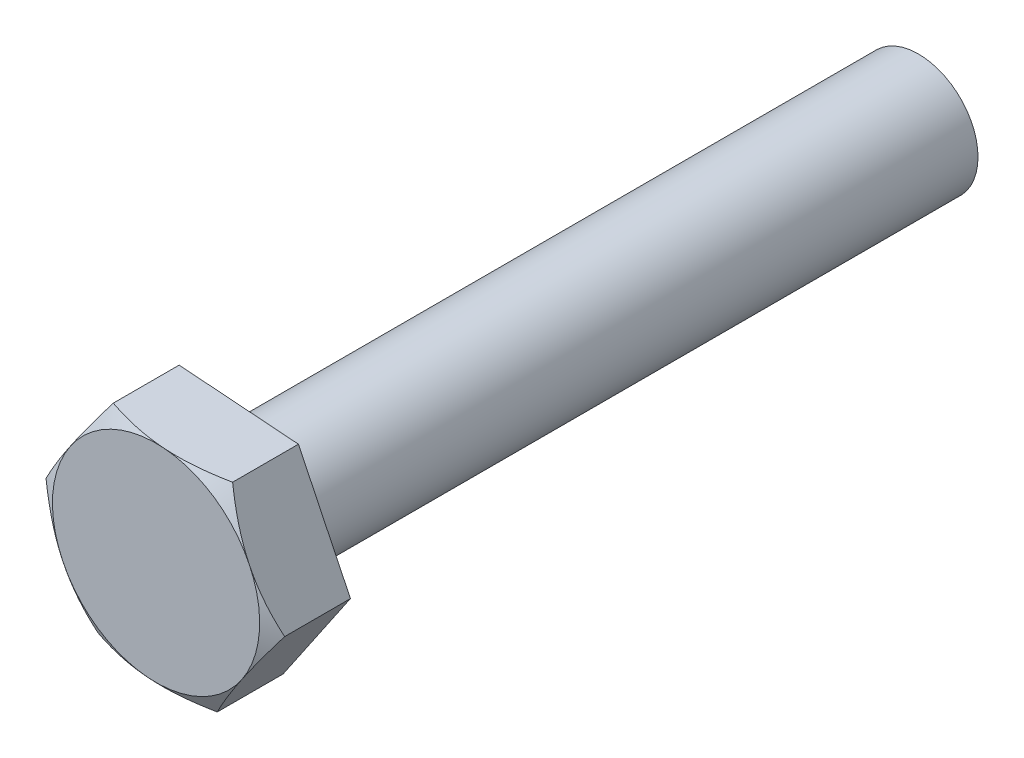
ISO-10303-21;
HEADER;
FILE_DESCRIPTION(('STEP AP214'),'2;1');
FILE_NAME('part.step','',(''),(''),'','','');
FILE_SCHEMA(('AUTOMOTIVE_DESIGN { 1 0 10303 214 1 1 1 1 }'));
ENDSEC;
DATA;
#1=APPLICATION_CONTEXT('core data for automotive mechanical design processes');
#2=APPLICATION_PROTOCOL_DEFINITION('international standard','automotive_design',2000,#1);
#3=PRODUCT_CONTEXT('',#1,'mechanical');
#4=PRODUCT('Part','Part','',(#3));
#5=PRODUCT_RELATED_PRODUCT_CATEGORY('part','',(#4));
#6=PRODUCT_DEFINITION_FORMATION('','',#4);
#7=PRODUCT_DEFINITION_CONTEXT('part definition',#1,'design');
#8=PRODUCT_DEFINITION('design','',#6,#7);
#9=PRODUCT_DEFINITION_SHAPE('','',#8);
#10=(LENGTH_UNIT() NAMED_UNIT(*) SI_UNIT(.MILLI.,.METRE.));
#11=(NAMED_UNIT(*) PLANE_ANGLE_UNIT() SI_UNIT($,.RADIAN.));
#12=(NAMED_UNIT(*) SI_UNIT($,.STERADIAN.) SOLID_ANGLE_UNIT());
#13=UNCERTAINTY_MEASURE_WITH_UNIT(LENGTH_MEASURE(1.E-05),#10,'distance_accuracy_value','');
#14=(GEOMETRIC_REPRESENTATION_CONTEXT(3) GLOBAL_UNCERTAINTY_ASSIGNED_CONTEXT((#13)) GLOBAL_UNIT_ASSIGNED_CONTEXT((#10,
#11,#12)) REPRESENTATION_CONTEXT('',''));
#15=CARTESIAN_POINT('',(0.,0.,0.));
#16=DIRECTION('',(0.,0.,1.));
#17=DIRECTION('',(1.,0.,0.));
#18=AXIS2_PLACEMENT_3D('',#15,#16,#17);
#19=CARTESIAN_POINT('',(9.02532611568119,-0.667823708475984,5.68));
#20=DIRECTION('',(-0.90056061302288,-0.434730470834349,0.));
#21=DIRECTION('',(0.434730470834349,-0.90056061302288,0.));
#22=AXIS2_PLACEMENT_3D('',#19,#20,#21);
#23=PLANE('',#22);
#24=CARTESIAN_POINT('',(9.02542266231326,-0.668023708475984,4.97991595255848));
#25=CARTESIAN_POINT('',(8.93894219601262,-0.488876151607613,5.03733280559735));
#26=CARTESIAN_POINT('',(8.85213929988489,-0.309060669157265,5.09214385373648));
#27=CARTESIAN_POINT('',(8.67782857675284,0.0520305867167305,5.19583661605288));
#28=CARTESIAN_POINT('',(8.59032046288016,0.233306954399005,5.24471577239802));
#29=CARTESIAN_POINT('',(8.32639499046103,0.780038552894863,5.38149591771282));
#30=CARTESIAN_POINT('',(8.14893580074119,1.14765197638902,5.45929467924828));
#31=CARTESIAN_POINT('',(7.88337155327417,1.69777835937952,5.55052289347268));
#32=CARTESIAN_POINT('',(7.79605985969465,1.87864783499536,5.57651117187037));
#33=CARTESIAN_POINT('',(7.62104162386459,2.24120473018334,5.62008910624887));
#34=CARTESIAN_POINT('',(7.53333511719222,2.42289207605393,5.63767950428598));
#35=CARTESIAN_POINT('',(7.35777108749343,2.78657960388437,5.66401587642687));
#36=CARTESIAN_POINT('',(7.26991384970841,2.96857919495588,5.67277188770728));
#37=CARTESIAN_POINT('',(7.09411821330301,3.33274650483905,5.68125176732875));
#38=CARTESIAN_POINT('',(7.00617981727401,3.5149142182826,5.68097591471372));
#39=CARTESIAN_POINT('',(6.84177592786831,3.85548309338903,5.67202028597551));
#40=CARTESIAN_POINT('',(6.76529883270309,4.01390828859564,5.66443298664409));
#41=CARTESIAN_POINT('',(6.61252349052611,4.33038818829448,5.64257457860654));
#42=CARTESIAN_POINT('',(6.53622525658551,4.48844286570929,5.62830299583113));
#43=CARTESIAN_POINT('',(6.30762620473036,4.96199444786551,5.57579925167254));
#44=CARTESIAN_POINT('',(6.15573002588704,5.27665312746632,5.52788463483773));
#45=CARTESIAN_POINT('',(5.85032637921295,5.90930833274877,5.40809727339062));
#46=CARTESIAN_POINT('',(5.69685788881901,6.22722411519578,5.33571675121987));
#47=CARTESIAN_POINT('',(5.39220953014186,6.85831471282552,5.17144287889555));
#48=CARTESIAN_POINT('',(5.24102576054486,7.17149760972731,5.07958811273296));
#49=CARTESIAN_POINT('',(5.09091880799825,7.48244983938109,4.97991595255846));
#50=B_SPLINE_CURVE_WITH_KNOTS('',3,(#24,#25,#26,#27,#28,#29,#30,#31,#32,#33,#34,#35,#36,#37,#38,
#39,#40,#41,#42,#43,#44,#45,#46,#47,#48,#49),.UNSPECIFIED.,.F.,.F.,(4,2,2,2,2,2,2,2,2,2,2,2,4),
(0.,0.621098263868457,1.24246340086594,2.48777554983899,3.09518037865444,3.70253152582372,
4.30919185212693,4.91583343537601,5.44394767439658,5.97209937452323,7.02915324486329,
8.10965053633612,9.18802673517135),.UNSPECIFIED.);
#51=CARTESIAN_POINT('',(9.02532611568119,-0.667823708475985,4.97998006383391));
#52=VERTEX_POINT('',#51);
#53=CARTESIAN_POINT('',(7.05817073515579,3.40721306545253,5.68));
#54=VERTEX_POINT('',#53);
#55=EDGE_CURVE('E222',#52,#54,#50,.T.);
#56=ORIENTED_EDGE('',*,*,#55,.F.);
#57=DIRECTION('',(0.,0.,-1.));
#58=VECTOR('',#57,1.);
#59=CARTESIAN_POINT('',(9.02532611568119,-0.667823708475984,5.68));
#60=LINE('',#59,#58);
#61=CARTESIAN_POINT('',(9.02532611568119,-0.667823708475984,0.));
#62=VERTEX_POINT('',#61);
#63=EDGE_CURVE('E225',#52,#62,#60,.T.);
#64=ORIENTED_EDGE('',*,*,#63,.T.);
#65=DIRECTION('',(-0.434730470834349,0.90056061302288,0.));
#66=VECTOR('',#65,1.);
#67=CARTESIAN_POINT('',(9.02532611568119,-0.667823708475984,0.));
#68=LINE('',#67,#66);
#69=CARTESIAN_POINT('',(5.09101535463032,7.48224983938109,0.));
#70=VERTEX_POINT('',#69);
#71=EDGE_CURVE('E228',#62,#70,#68,.T.);
#72=ORIENTED_EDGE('',*,*,#71,.T.);
#73=DIRECTION('',(0.,0.,-1.));
#74=VECTOR('',#73,1.);
#75=CARTESIAN_POINT('',(5.09101535463032,7.48224983938109,5.68));
#76=LINE('',#75,#74);
#77=CARTESIAN_POINT('',(5.09101535463032,7.48224983938109,4.97998006383389));
#78=VERTEX_POINT('',#77);
#79=EDGE_CURVE('E253',#78,#70,#76,.T.);
#80=ORIENTED_EDGE('',*,*,#79,.F.);
#81=EDGE_CURVE('E118',#54,#78,#50,.T.);
#82=ORIENTED_EDGE('',*,*,#81,.F.);
#83=EDGE_LOOP('',(#56,#64,#72,#80,#82));
#84=FACE_BOUND('',#83,.T.);
#85=ADVANCED_FACE('F40',(#84),#23,.F.);
#86=CARTESIAN_POINT('',(5.09101535463032,7.48224983938109,5.68));
#87=DIRECTION('',(-0.0737926749697192,-0.997273603942676,0.));
#88=DIRECTION('',(0.997273603942676,-0.0737926749697192,0.));
#89=AXIS2_PLACEMENT_3D('',#86,#87,#88);
#90=PLANE('',#89);
#91=CARTESIAN_POINT('',(5.09121535463032,7.48223504049848,4.97992217000593));
#92=CARTESIAN_POINT('',(4.89282896705362,7.49691452480348,5.03733876581251));
#93=CARTESIAN_POINT('',(4.69370292492865,7.51164873941263,5.09214955049874));
#94=CARTESIAN_POINT('',(4.29383372992144,7.54123682579225,5.19584177447214));
#95=CARTESIAN_POINT('',(4.09308991896382,7.55609074625662,5.24472065592345));
#96=CARTESIAN_POINT('',(3.48764430712158,7.60089033893599,5.38149995736403));
#97=CARTESIAN_POINT('',(3.08055254948074,7.63101285459837,5.45929813536252));
#98=CARTESIAN_POINT('',(2.4713476064715,7.67609061678088,5.55052548006968));
#99=CARTESIAN_POINT('',(2.27105438587937,7.69091119607563,5.57651347406957));
#100=CARTESIAN_POINT('',(1.86956217127299,7.72061937683785,5.62009084237101));
#101=CARTESIAN_POINT('',(1.66836325887403,7.73550697226625,5.63768095872652));
#102=CARTESIAN_POINT('',(1.2656190115664,7.76530779645331,5.66401677745409));
#103=CARTESIAN_POINT('',(1.06407433098216,7.78022097679563,5.67277251688957));
#104=CARTESIAN_POINT('',(0.660798798573856,7.81006111311188,5.68125186926885));
#105=CARTESIAN_POINT('',(0.459067952694214,7.82498806864596,5.68097576126478));
#106=CARTESIAN_POINT('',(0.0819265254066567,7.85289442719332,5.67201970966869));
#107=CARTESIAN_POINT('',(-0.0935106732094232,7.8658757997313,5.66443229435233));
#108=CARTESIAN_POINT('',(-0.443974793851515,7.8918081866318,5.64257377990052));
#109=CARTESIAN_POINT('',(-0.619001685893185,7.90475919877563,5.62830220671747));
#110=CARTESIAN_POINT('',(-1.14340414231216,7.94356205073808,5.57579867395743));
#111=CARTESIAN_POINT('',(-1.49185147524533,7.96934520661582,5.52788444159992));
#112=CARTESIAN_POINT('',(-2.19244235578963,8.02118501760687,5.40809828119802));
#113=CARTESIAN_POINT('',(-2.5444964918374,8.04723505676404,5.33571859106147));
#114=CARTESIAN_POINT('',(-3.24335476516729,8.09894666450123,5.1714466989218));
#115=CARTESIAN_POINT('',(-3.59016785169128,8.12460889527514,5.07959307933958));
#116=CARTESIAN_POINT('',(-3.9345107610509,8.15008834673966,4.97992217000593));
#117=B_SPLINE_CURVE_WITH_KNOTS('',3,(#91,#92,#93,#94,#95,#96,#97,#98,#99,#100,#101,#102,#103,
#104,#105,#106,#107,#108,#109,#110,#111,#112,#113,#114,#115,#116),.UNSPECIFIED.,.F.,.F.,(4,2,2,
2,2,2,2,2,2,2,2,2,4),(0.,0.621097527063638,1.24246192682244,2.48777256075876,3.09517672261608,
3.70252720303888,4.30918687040672,4.91582779415534,5.44393726565573,5.97208419691665,
7.02912850033505,8.10961571870508,9.18798191586244),.UNSPECIFIED.);
#118=CARTESIAN_POINT('',(0.578352296789714,7.81616169361907,5.68));
#119=VERTEX_POINT('',#118);
#120=EDGE_CURVE('E114',#78,#119,#117,.T.);
#121=ORIENTED_EDGE('',*,*,#120,.F.);
#122=ORIENTED_EDGE('',*,*,#79,.T.);
#123=DIRECTION('',(-0.997273603942676,0.0737926749697192,0.));
#124=VECTOR('',#123,1.);
#125=CARTESIAN_POINT('',(5.09101535463032,7.48224983938109,0.));
#126=LINE('',#125,#124);
#127=CARTESIAN_POINT('',(-3.9343107610509,8.15007354785705,0.));
#128=VERTEX_POINT('',#127);
#129=EDGE_CURVE('E297',#70,#128,#126,.T.);
#130=ORIENTED_EDGE('',*,*,#129,.T.);
#131=DIRECTION('',(0.,0.,-1.));
#132=VECTOR('',#131,1.);
#133=CARTESIAN_POINT('',(-3.9343107610509,8.15007354785705,5.68));
#134=LINE('',#133,#132);
#135=CARTESIAN_POINT('',(-3.9343107610509,8.15007354785705,4.97998006383389));
#136=VERTEX_POINT('',#135);
#137=EDGE_CURVE('E143',#136,#128,#134,.T.);
#138=ORIENTED_EDGE('',*,*,#137,.F.);
#139=EDGE_CURVE('E123',#119,#136,#117,.T.);
#140=ORIENTED_EDGE('',*,*,#139,.F.);
#141=EDGE_LOOP('',(#121,#122,#130,#138,#140));
#142=FACE_BOUND('',#141,.T.);
#143=ADVANCED_FACE('F141',(#142),#90,.F.);
#144=CARTESIAN_POINT('',(-3.9343107610509,8.15007354785705,5.68));
#145=DIRECTION('',(0.826767938053159,-0.562543133108323,0.));
#146=DIRECTION('',(0.562543133108323,0.826767938053159,0.));
#147=AXIS2_PLACEMENT_3D('',#144,#145,#146);
#148=PLANE('',#147);
#149=CARTESIAN_POINT('',(-3.93417467857667,8.15027354785705,4.97991023023042));
#150=CARTESIAN_POINT('',(-4.04608087458931,7.98580535068695,5.03732732001623));
#151=CARTESIAN_POINT('',(-4.15840429667078,7.82072395762782,5.09213861062753));
#152=CARTESIAN_POINT('',(-4.38396332642765,7.48922053510635,5.19583186841461));
#153=CARTESIAN_POINT('',(-4.49719930531291,7.322797960078,5.24471127776172));
#154=CARTESIAN_POINT('',(-4.83872032238021,6.82086555620636,5.38149219974679));
#155=CARTESIAN_POINT('',(-5.0683534990854,6.48337437226084,5.45929149834793));
#156=CARTESIAN_POINT('',(-5.41199511172374,5.97832533550449,5.55052051284385));
#157=CARTESIAN_POINT('',(-5.52497692259168,5.81227631044099,5.57650905299077));
#158=CARTESIAN_POINT('',(-5.75145148603006,5.47942733084215,5.62008750836577));
#159=CARTESIAN_POINT('',(-5.86494419256154,5.31262744397013,5.63767816565231));
#160=CARTESIAN_POINT('',(-6.09212502646715,4.97874046080582,5.66401504713471));
#161=CARTESIAN_POINT('',(-6.20581278472697,4.81165390699972,5.67277130861136));
#162=CARTESIAN_POINT('',(-6.43329332999024,4.47732643896127,5.68125167348759));
#163=CARTESIAN_POINT('',(-6.54708611364035,4.31008552965731,5.68097605592352));
#164=CARTESIAN_POINT('',(-6.75982640878962,3.99742176254398,5.67202081637179));
#165=CARTESIAN_POINT('',(-6.8587889316759,3.85197684254446,5.66443362379158));
#166=CARTESIAN_POINT('',(-7.05648254619053,3.56142713636385,5.64257531369865));
#167=CARTESIAN_POINT('',(-7.15521362090424,3.41632237504218,5.62830372209674));
#168=CARTESIAN_POINT('',(-7.45102427133773,2.98157035849599,5.57579978337905));
#169=CARTESIAN_POINT('',(-7.64758023591185,2.69269265298554,5.52788481268637));
#170=CARTESIAN_POINT('',(-8.04277722643596,2.11187283357888,5.4080963458401));
#171=CARTESIAN_POINT('',(-8.24136781393368,1.82000484892312,5.33571505789321));
#172=CARTESIAN_POINT('',(-8.63558744459015,1.24062145235224,5.17143936307339));
#173=CARTESIAN_POINT('',(-8.83122153626799,0.953098620643886,5.07958354163656));
#174=CARTESIAN_POINT('',(-9.02546219815544,0.667623708475963,4.97991023023043));
#175=B_SPLINE_CURVE_WITH_KNOTS('',3,(#149,#150,#151,#152,#153,#154,#155,#156,#157,#158,#159,
#160,#161,#162,#163,#164,#165,#166,#167,#168,#169,#170,#171,#172,#173,#174),.UNSPECIFIED.,.F.,
.F.,(4,2,2,2,2,2,2,2,2,2,2,2,4),(0.,0.621098941998522,1.24246475752538,2.48777830088661,
3.09518374354778,3.70253550436798,4.309196437133,4.91583862736397,5.44395725423133,
5.97211334344319,7.02917601881978,8.10968258120494,9.18806798521429),.UNSPECIFIED.);
#176=CARTESIAN_POINT('',(-6.47981843836606,4.4089486281665,5.68));
#177=VERTEX_POINT('',#176);
#178=EDGE_CURVE('E129',#136,#177,#175,.T.);
#179=ORIENTED_EDGE('',*,*,#178,.F.);
#180=ORIENTED_EDGE('',*,*,#137,.T.);
#181=DIRECTION('',(-0.562543133108323,-0.826767938053159,0.));
#182=VECTOR('',#181,1.);
#183=CARTESIAN_POINT('',(-3.9343107610509,8.15007354785705,0.));
#184=LINE('',#183,#182);
#185=CARTESIAN_POINT('',(-9.02532611568122,0.667823708475963,0.));
#186=VERTEX_POINT('',#185);
#187=EDGE_CURVE('E300',#128,#186,#184,.T.);
#188=ORIENTED_EDGE('',*,*,#187,.T.);
#189=DIRECTION('',(0.,0.,-1.));
#190=VECTOR('',#189,1.);
#191=CARTESIAN_POINT('',(-9.02532611568122,0.667823708475963,5.68));
#192=LINE('',#191,#190);
#193=CARTESIAN_POINT('',(-9.02532611568122,0.667823708475963,4.97998006383389));
#194=VERTEX_POINT('',#193);
#195=EDGE_CURVE('E249',#194,#186,#192,.T.);
#196=ORIENTED_EDGE('',*,*,#195,.F.);
#197=EDGE_CURVE('E146',#177,#194,#175,.T.);
#198=ORIENTED_EDGE('',*,*,#197,.F.);
#199=EDGE_LOOP('',(#179,#180,#188,#196,#198));
#200=FACE_BOUND('',#199,.T.);
#201=ADVANCED_FACE('F208',(#200),#148,.F.);
#202=CARTESIAN_POINT('',(-9.02532611568122,0.667823708475963,5.68));
#203=DIRECTION('',(0.900560613022878,0.434730470834353,0.));
#204=DIRECTION('',(-0.434730470834353,0.900560613022878,0.));
#205=AXIS2_PLACEMENT_3D('',#202,#203,#204);
#206=PLANE('',#205);
#207=CARTESIAN_POINT('',(-9.02542266231329,0.668023708475962,4.97991595255846));
#208=CARTESIAN_POINT('',(-8.93894219601265,0.488876151607591,5.03733280559733));
#209=CARTESIAN_POINT('',(-8.85213929988492,0.309060669157243,5.09214385373647));
#210=CARTESIAN_POINT('',(-8.67782857675286,-0.0520305867167524,5.19583661605286));
#211=CARTESIAN_POINT('',(-8.59032046288018,-0.233306954399027,5.24471577239801));
#212=CARTESIAN_POINT('',(-8.32639499046105,-0.780038552894886,5.38149591771281));
#213=CARTESIAN_POINT('',(-8.14893580074121,-1.14765197638905,5.45929467924827));
#214=CARTESIAN_POINT('',(-7.88337155327419,-1.69777835937955,5.55052289347267));
#215=CARTESIAN_POINT('',(-7.79605985969467,-1.87864783499539,5.57651117187036));
#216=CARTESIAN_POINT('',(-7.6210416238646,-2.24120473018337,5.62008910624886));
#217=CARTESIAN_POINT('',(-7.53333511719223,-2.42289207605395,5.63767950428597));
#218=CARTESIAN_POINT('',(-7.35777108749344,-2.78657960388439,5.66401587642686));
#219=CARTESIAN_POINT('',(-7.26991384970842,-2.96857919495591,5.67277188770727));
#220=CARTESIAN_POINT('',(-7.09411821330302,-3.33274650483908,5.68125176732874));
#221=CARTESIAN_POINT('',(-7.00617981727401,-3.51491421828262,5.68097591471371));
#222=CARTESIAN_POINT('',(-6.84177592786831,-3.85548309338905,5.6720202859755));
#223=CARTESIAN_POINT('',(-6.7652988327031,-4.01390828859567,5.66443298664408));
#224=CARTESIAN_POINT('',(-6.61252349052611,-4.33038818829451,5.64257457860653));
#225=CARTESIAN_POINT('',(-6.53622525658551,-4.48844286570931,5.62830299583112));
#226=CARTESIAN_POINT('',(-6.30762620473036,-4.96199444786553,5.57579925167253));
#227=CARTESIAN_POINT('',(-6.15573002588704,-5.27665312746633,5.52788463483773));
#228=CARTESIAN_POINT('',(-5.85032637921295,-5.90930833274878,5.40809727339061));
#229=CARTESIAN_POINT('',(-5.69685788881901,-6.22722411519578,5.33571675121987));
#230=CARTESIAN_POINT('',(-5.39220953014186,-6.85831471282552,5.17144287889554));
#231=CARTESIAN_POINT('',(-5.24102576054486,-7.17149760972731,5.07958811273296));
#232=CARTESIAN_POINT('',(-5.09091880799825,-7.48244983938109,4.97991595255846));
#233=B_SPLINE_CURVE_WITH_KNOTS('',3,(#207,#208,#209,#210,#211,#212,#213,#214,#215,#216,#217,
#218,#219,#220,#221,#222,#223,#224,#225,#226,#227,#228,#229,#230,#231,#232),.UNSPECIFIED.,.F.,
.F.,(4,2,2,2,2,2,2,2,2,2,2,2,4),(0.,0.621098263868459,1.24246340086595,2.48777554983899,
3.09518037865445,3.70253152582373,4.30919185212695,4.91583343537602,5.44394767439659,
5.97209937452324,7.02915324486329,8.10965053633612,9.18802673517134),.UNSPECIFIED.);
#234=CARTESIAN_POINT('',(-7.05817073515577,-3.40721306545256,5.68));
#235=VERTEX_POINT('',#234);
#236=EDGE_CURVE('E202',#194,#235,#233,.T.);
#237=ORIENTED_EDGE('',*,*,#236,.F.);
#238=ORIENTED_EDGE('',*,*,#195,.T.);
#239=DIRECTION('',(0.434730470834353,-0.900560613022878,0.));
#240=VECTOR('',#239,1.);
#241=CARTESIAN_POINT('',(-9.02532611568122,0.667823708475963,0.));
#242=LINE('',#241,#240);
#243=CARTESIAN_POINT('',(-5.09101535463032,-7.48224983938109,0.));
#244=VERTEX_POINT('',#243);
#245=EDGE_CURVE('E306',#186,#244,#242,.T.);
#246=ORIENTED_EDGE('',*,*,#245,.T.);
#247=DIRECTION('',(0.,0.,-1.));
#248=VECTOR('',#247,1.);
#249=CARTESIAN_POINT('',(-5.09101535463032,-7.48224983938109,5.68));
#250=LINE('',#249,#248);
#251=CARTESIAN_POINT('',(-5.09101535463032,-7.48224983938109,4.97998006383389));
#252=VERTEX_POINT('',#251);
#253=EDGE_CURVE('E241',#252,#244,#250,.T.);
#254=ORIENTED_EDGE('',*,*,#253,.F.);
#255=EDGE_CURVE('E195',#235,#252,#233,.T.);
#256=ORIENTED_EDGE('',*,*,#255,.F.);
#257=EDGE_LOOP('',(#237,#238,#246,#254,#256));
#258=FACE_BOUND('',#257,.T.);
#259=ADVANCED_FACE('F204',(#258),#206,.F.);
#260=CARTESIAN_POINT('',(-5.09101535463032,-7.48224983938109,5.68));
#261=DIRECTION('',(0.0737926749697193,0.997273603942676,0.));
#262=DIRECTION('',(-0.997273603942676,0.0737926749697193,0.));
#263=AXIS2_PLACEMENT_3D('',#260,#261,#262);
#264=PLANE('',#263);
#265=CARTESIAN_POINT('',(-5.09121535463032,-7.48223504049848,4.97992217000593));
#266=CARTESIAN_POINT('',(-4.89282896705362,-7.49691452480348,5.03733876581251));
#267=CARTESIAN_POINT('',(-4.69370292492865,-7.51164873941263,5.09214955049874));
#268=CARTESIAN_POINT('',(-4.29383372992144,-7.54123682579225,5.19584177447214));
#269=CARTESIAN_POINT('',(-4.09308991896382,-7.55609074625661,5.24472065592345));
#270=CARTESIAN_POINT('',(-3.48764430712158,-7.60089033893598,5.38149995736403));
#271=CARTESIAN_POINT('',(-3.08055254948074,-7.63101285459836,5.45929813536253));
#272=CARTESIAN_POINT('',(-2.4713476064715,-7.67609061678088,5.55052548006968));
#273=CARTESIAN_POINT('',(-2.27105438587937,-7.69091119607563,5.57651347406957));
#274=CARTESIAN_POINT('',(-1.86956217127299,-7.72061937683785,5.62009084237101));
#275=CARTESIAN_POINT('',(-1.66836325887403,-7.73550697226625,5.63768095872653));
#276=CARTESIAN_POINT('',(-1.2656190115664,-7.76530779645331,5.66401677745409));
#277=CARTESIAN_POINT('',(-1.06407433098216,-7.78022097679563,5.67277251688957));
#278=CARTESIAN_POINT('',(-0.660798798573858,-7.81006111311188,5.68125186926885));
#279=CARTESIAN_POINT('',(-0.459067952694216,-7.82498806864596,5.68097576126478));
#280=CARTESIAN_POINT('',(-0.0819265254066584,-7.85289442719332,5.67201970966869));
#281=CARTESIAN_POINT('',(0.0935106732094213,-7.8658757997313,5.66443229435233));
#282=CARTESIAN_POINT('',(0.443974793851513,-7.89180818663179,5.64257377990052));
#283=CARTESIAN_POINT('',(0.619001685893183,-7.90475919877563,5.62830220671747));
#284=CARTESIAN_POINT('',(1.14340414231216,-7.94356205073808,5.57579867395743));
#285=CARTESIAN_POINT('',(1.49185147524533,-7.96934520661582,5.52788444159992));
#286=CARTESIAN_POINT('',(2.19244235578962,-8.02118501760687,5.40809828119803));
#287=CARTESIAN_POINT('',(2.5444964918374,-8.04723505676404,5.33571859106147));
#288=CARTESIAN_POINT('',(3.24335476516729,-8.09894666450123,5.1714466989218));
#289=CARTESIAN_POINT('',(3.59016785169127,-8.12460889527514,5.07959307933958));
#290=CARTESIAN_POINT('',(3.93451076105089,-8.15008834673966,4.97992217000593));
#291=B_SPLINE_CURVE_WITH_KNOTS('',3,(#265,#266,#267,#268,#269,#270,#271,#272,#273,#274,#275,
#276,#277,#278,#279,#280,#281,#282,#283,#284,#285,#286,#287,#288,#289,#290),.UNSPECIFIED.,.F.,
.F.,(4,2,2,2,2,2,2,2,2,2,2,2,4),(0.,0.621097527063639,1.24246192682244,2.48777256075876,
3.09517672261608,3.70252720303888,4.30918687040671,4.91582779415534,5.44393726565573,
5.97208419691664,7.02912850033505,8.10961571870508,9.18798191586244),.UNSPECIFIED.);
#292=CARTESIAN_POINT('',(-0.578352296789715,-7.81616169361907,5.68));
#293=VERTEX_POINT('',#292);
#294=EDGE_CURVE('E203',#252,#293,#291,.T.);
#295=ORIENTED_EDGE('',*,*,#294,.F.);
#296=ORIENTED_EDGE('',*,*,#253,.T.);
#297=DIRECTION('',(0.997273603942676,-0.0737926749697193,0.));
#298=VECTOR('',#297,1.);
#299=CARTESIAN_POINT('',(-5.09101535463032,-7.48224983938109,0.));
#300=LINE('',#299,#298);
#301=CARTESIAN_POINT('',(3.93431076105089,-8.15007354785705,0.));
#302=VERTEX_POINT('',#301);
#303=EDGE_CURVE('E243',#244,#302,#300,.T.);
#304=ORIENTED_EDGE('',*,*,#303,.T.);
#305=DIRECTION('',(0.,0.,-1.));
#306=VECTOR('',#305,1.);
#307=CARTESIAN_POINT('',(3.93431076105089,-8.15007354785705,5.68));
#308=LINE('',#307,#306);
#309=CARTESIAN_POINT('',(3.93431076105089,-8.15007354785705,4.97998006383389));
#310=VERTEX_POINT('',#309);
#311=EDGE_CURVE('E237',#310,#302,#308,.T.);
#312=ORIENTED_EDGE('',*,*,#311,.F.);
#313=EDGE_CURVE('E189',#293,#310,#291,.T.);
#314=ORIENTED_EDGE('',*,*,#313,.F.);
#315=EDGE_LOOP('',(#295,#296,#304,#312,#314));
#316=FACE_BOUND('',#315,.T.);
#317=ADVANCED_FACE('F207',(#316),#264,.F.);
#318=CARTESIAN_POINT('',(3.93431076105089,-8.15007354785705,5.68));
#319=DIRECTION('',(-0.826767938053159,0.562543133108322,0.));
#320=DIRECTION('',(-0.562543133108322,-0.826767938053159,0.));
#321=AXIS2_PLACEMENT_3D('',#318,#319,#320);
#322=PLANE('',#321);
#323=CARTESIAN_POINT('',(3.93417467857666,-8.15027354785705,4.97991023023043));
#324=CARTESIAN_POINT('',(4.04608087458931,-7.98580535068695,5.03732732001623));
#325=CARTESIAN_POINT('',(4.15840429667078,-7.82072395762782,5.09213861062753));
#326=CARTESIAN_POINT('',(4.38396332642765,-7.48922053510634,5.19583186841461));
#327=CARTESIAN_POINT('',(4.49719930531291,-7.322797960078,5.24471127776172));
#328=CARTESIAN_POINT('',(4.83872032238021,-6.82086555620636,5.38149219974679));
#329=CARTESIAN_POINT('',(5.0683534990854,-6.48337437226084,5.45929149834793));
#330=CARTESIAN_POINT('',(5.41199511172373,-5.97832533550449,5.55052051284385));
#331=CARTESIAN_POINT('',(5.52497692259168,-5.81227631044099,5.57650905299077));
#332=CARTESIAN_POINT('',(5.75145148603006,-5.47942733084215,5.62008750836577));
#333=CARTESIAN_POINT('',(5.86494419256153,-5.31262744397013,5.63767816565232));
#334=CARTESIAN_POINT('',(6.09212502646714,-4.97874046080582,5.66401504713471));
#335=CARTESIAN_POINT('',(6.20581278472696,-4.81165390699972,5.67277130861137));
#336=CARTESIAN_POINT('',(6.43329332999023,-4.47732643896127,5.68125167348759));
#337=CARTESIAN_POINT('',(6.54708611364034,-4.31008552965731,5.68097605592353));
#338=CARTESIAN_POINT('',(6.75982640878961,-3.99742176254398,5.6720208163718));
#339=CARTESIAN_POINT('',(6.85878893167589,-3.85197684254446,5.66443362379158));
#340=CARTESIAN_POINT('',(7.05648254619052,-3.56142713636385,5.64257531369865));
#341=CARTESIAN_POINT('',(7.15521362090423,-3.41632237504218,5.62830372209674));
#342=CARTESIAN_POINT('',(7.45102427133771,-2.98157035849599,5.57579978337905));
#343=CARTESIAN_POINT('',(7.64758023591183,-2.69269265298554,5.52788481268638));
#344=CARTESIAN_POINT('',(8.04277722643594,-2.11187283357889,5.40809634584011));
#345=CARTESIAN_POINT('',(8.24136781393366,-1.82000484892313,5.33571505789322));
#346=CARTESIAN_POINT('',(8.63558744459012,-1.24062145235226,5.1714393630734));
#347=CARTESIAN_POINT('',(8.83122153626797,-0.953098620643904,5.07958354163658));
#348=CARTESIAN_POINT('',(9.02546219815541,-0.667623708475983,4.97991023023044));
#349=B_SPLINE_CURVE_WITH_KNOTS('',3,(#323,#324,#325,#326,#327,#328,#329,#330,#331,#332,#333,
#334,#335,#336,#337,#338,#339,#340,#341,#342,#343,#344,#345,#346,#347,#348),.UNSPECIFIED.,.F.,
.F.,(4,2,2,2,2,2,2,2,2,2,2,2,4),(0.,0.621098941998522,1.24246475752537,2.48777830088661,
3.09518374354778,3.70253550436798,4.309196437133,4.91583862736397,5.44395725423132,
5.97211334344318,7.02917601881976,8.10968258120491,9.18806798521426),.UNSPECIFIED.);
#350=CARTESIAN_POINT('',(6.47981843836605,-4.40894862816649,5.68));
#351=VERTEX_POINT('',#350);
#352=EDGE_CURVE('E277',#310,#351,#349,.T.);
#353=ORIENTED_EDGE('',*,*,#352,.F.);
#354=ORIENTED_EDGE('',*,*,#311,.T.);
#355=DIRECTION('',(0.562543133108322,0.826767938053159,0.));
#356=VECTOR('',#355,1.);
#357=CARTESIAN_POINT('',(3.93431076105089,-8.15007354785705,0.));
#358=LINE('',#357,#356);
#359=EDGE_CURVE('E234',#302,#62,#358,.T.);
#360=ORIENTED_EDGE('',*,*,#359,.T.);
#361=ORIENTED_EDGE('',*,*,#63,.F.);
#362=EDGE_CURVE('E137',#351,#52,#349,.T.);
#363=ORIENTED_EDGE('',*,*,#362,.F.);
#364=EDGE_LOOP('',(#353,#354,#360,#361,#363));
#365=FACE_BOUND('',#364,.T.);
#366=ADVANCED_FACE('F232',(#365),#322,.F.);
#367=CARTESIAN_POINT('',(0.,0.,0.));
#368=DIRECTION('',(0.,0.,1.));
#369=DIRECTION('',(1.,0.,0.));
#370=AXIS2_PLACEMENT_3D('',#367,#368,#369);
#371=PLANE('',#370);
#372=CARTESIAN_POINT('',(0.,0.,0.));
#373=DIRECTION('',(0.,0.,-1.));
#374=DIRECTION('',(-1.,0.,0.));
#375=AXIS2_PLACEMENT_3D('',#372,#373,#374);
#376=CIRCLE('',#375,4.5);
#377=CARTESIAN_POINT('',(4.5,0.,0.));
#378=VERTEX_POINT('',#377);
#379=EDGE_CURVE('E12',#378,#378,#376,.T.);
#380=ORIENTED_EDGE('',*,*,#379,.F.);
#381=EDGE_LOOP('',(#380));
#382=FACE_BOUND('',#381,.T.);
#383=ORIENTED_EDGE('',*,*,#71,.F.);
#384=ORIENTED_EDGE('',*,*,#359,.F.);
#385=ORIENTED_EDGE('',*,*,#303,.F.);
#386=ORIENTED_EDGE('',*,*,#245,.F.);
#387=ORIENTED_EDGE('',*,*,#187,.F.);
#388=ORIENTED_EDGE('',*,*,#129,.F.);
#389=EDGE_LOOP('',(#383,#384,#385,#386,#387,#388));
#390=FACE_BOUND('',#389,.T.);
#391=ADVANCED_FACE('F172',(#382,#390),#371,.F.);
#392=CARTESIAN_POINT('',(0.,0.,5.68));
#393=DIRECTION('',(0.,0.,-1.));
#394=DIRECTION('',(1.,0.,0.));
#395=AXIS2_PLACEMENT_3D('',#392,#393,#394);
#396=CONICAL_SURFACE('',#395,7.83752990424917,1.0471975511966);
#397=ORIENTED_EDGE('',*,*,#55,.T.);
#398=CARTESIAN_POINT('',(0.,0.,5.68));
#399=DIRECTION('',(0.,0.,1.));
#400=DIRECTION('',(1.,0.,0.));
#401=AXIS2_PLACEMENT_3D('',#398,#399,#400);
#402=CIRCLE('',#401,7.83752990424917);
#403=EDGE_CURVE('E44',#351,#54,#402,.T.);
#404=ORIENTED_EDGE('',*,*,#403,.F.);
#405=ORIENTED_EDGE('',*,*,#362,.T.);
#406=EDGE_LOOP('',(#397,#404,#405));
#407=FACE_BOUND('',#406,.T.);
#408=ADVANCED_FACE('F166',(#407),#396,.T.);
#409=ORIENTED_EDGE('',*,*,#313,.T.);
#410=ORIENTED_EDGE('',*,*,#352,.T.);
#411=EDGE_CURVE('E66',#293,#351,#402,.T.);
#412=ORIENTED_EDGE('',*,*,#411,.F.);
#413=EDGE_LOOP('',(#409,#410,#412));
#414=FACE_BOUND('',#413,.T.);
#415=ADVANCED_FACE('F171',(#414),#396,.T.);
#416=ORIENTED_EDGE('',*,*,#255,.T.);
#417=ORIENTED_EDGE('',*,*,#294,.T.);
#418=EDGE_CURVE('E258',#235,#293,#402,.T.);
#419=ORIENTED_EDGE('',*,*,#418,.F.);
#420=EDGE_LOOP('',(#416,#417,#419));
#421=FACE_BOUND('',#420,.T.);
#422=ADVANCED_FACE('F271',(#421),#396,.T.);
#423=ORIENTED_EDGE('',*,*,#197,.T.);
#424=ORIENTED_EDGE('',*,*,#236,.T.);
#425=EDGE_CURVE('E134',#177,#235,#402,.T.);
#426=ORIENTED_EDGE('',*,*,#425,.F.);
#427=EDGE_LOOP('',(#423,#424,#426));
#428=FACE_BOUND('',#427,.T.);
#429=ADVANCED_FACE('F312',(#428),#396,.T.);
#430=ORIENTED_EDGE('',*,*,#139,.T.);
#431=ORIENTED_EDGE('',*,*,#178,.T.);
#432=EDGE_CURVE('E50',#119,#177,#402,.T.);
#433=ORIENTED_EDGE('',*,*,#432,.F.);
#434=EDGE_LOOP('',(#430,#431,#433));
#435=FACE_BOUND('',#434,.T.);
#436=ADVANCED_FACE('F127',(#435),#396,.T.);
#437=ORIENTED_EDGE('',*,*,#81,.T.);
#438=ORIENTED_EDGE('',*,*,#120,.T.);
#439=CARTESIAN_POINT('',(0.,0.,5.68));
#440=DIRECTION('',(0.,0.,1.));
#441=DIRECTION('',(1.,0.,0.));
#442=AXIS2_PLACEMENT_3D('',#439,#440,#441);
#443=CIRCLE('',#442,7.83752990424917);
#444=EDGE_CURVE('E58',#54,#119,#443,.T.);
#445=ORIENTED_EDGE('',*,*,#444,.F.);
#446=EDGE_LOOP('',(#437,#438,#445));
#447=FACE_BOUND('',#446,.T.);
#448=ADVANCED_FACE('F116',(#447),#396,.T.);
#449=CARTESIAN_POINT('',(0.,0.,5.68));
#450=DIRECTION('',(0.,0.,1.));
#451=DIRECTION('',(1.,0.,0.));
#452=AXIS2_PLACEMENT_3D('',#449,#450,#451);
#453=PLANE('',#452);
#454=ORIENTED_EDGE('',*,*,#403,.T.);
#455=ORIENTED_EDGE('',*,*,#444,.T.);
#456=ORIENTED_EDGE('',*,*,#432,.T.);
#457=ORIENTED_EDGE('',*,*,#425,.T.);
#458=ORIENTED_EDGE('',*,*,#418,.T.);
#459=ORIENTED_EDGE('',*,*,#411,.T.);
#460=EDGE_LOOP('',(#454,#455,#456,#457,#458,#459));
#461=FACE_BOUND('',#460,.T.);
#462=ADVANCED_FACE('F135',(#461),#453,.T.);
#463=CARTESIAN_POINT('',(0.,0.,-52.));
#464=DIRECTION('',(0.,0.,1.));
#465=DIRECTION('',(1.,0.,0.));
#466=AXIS2_PLACEMENT_3D('',#463,#464,#465);
#467=CYLINDRICAL_SURFACE('',#466,4.5);
#468=CARTESIAN_POINT('',(0.,0.,-52.));
#469=DIRECTION('',(0.,0.,-1.));
#470=DIRECTION('',(-1.,0.,0.));
#471=AXIS2_PLACEMENT_3D('',#468,#469,#470);
#472=CIRCLE('',#471,4.5);
#473=CARTESIAN_POINT('',(4.5,0.,-52.));
#474=VERTEX_POINT('',#473);
#475=EDGE_CURVE('E138',#474,#474,#472,.T.);
#476=CARTESIAN_POINT('',(4.5,0.,-52.));
#477=CARTESIAN_POINT('',(4.5,0.,-51.4583333333333));
#478=CARTESIAN_POINT('',(4.5,0.,-50.9166666666667));
#479=CARTESIAN_POINT('',(4.5,0.,-49.8333333333333));
#480=CARTESIAN_POINT('',(4.5,0.,-49.2916666666667));
#481=CARTESIAN_POINT('',(4.5,0.,-48.2083333333333));
#482=CARTESIAN_POINT('',(4.5,0.,-47.6666666666667));
#483=CARTESIAN_POINT('',(4.5,0.,-46.5833333333333));
#484=CARTESIAN_POINT('',(4.5,0.,-46.0416666666667));
#485=CARTESIAN_POINT('',(4.5,0.,-44.9583333333333));
#486=CARTESIAN_POINT('',(4.5,0.,-44.4166666666667));
#487=CARTESIAN_POINT('',(4.5,0.,-43.3333333333333));
#488=CARTESIAN_POINT('',(4.5,0.,-42.7916666666667));
#489=CARTESIAN_POINT('',(4.5,0.,-41.7083333333333));
#490=CARTESIAN_POINT('',(4.5,0.,-41.1666666666667));
#491=CARTESIAN_POINT('',(4.5,0.,-40.0833333333333));
#492=CARTESIAN_POINT('',(4.5,0.,-39.5416666666667));
#493=CARTESIAN_POINT('',(4.5,0.,-38.4583333333333));
#494=CARTESIAN_POINT('',(4.5,0.,-37.9166666666667));
#495=CARTESIAN_POINT('',(4.5,0.,-36.8333333333333));
#496=CARTESIAN_POINT('',(4.5,0.,-36.2916666666667));
#497=CARTESIAN_POINT('',(4.5,0.,-35.2083333333333));
#498=CARTESIAN_POINT('',(4.5,0.,-34.6666666666667));
#499=CARTESIAN_POINT('',(4.5,0.,-33.5833333333333));
#500=CARTESIAN_POINT('',(4.5,0.,-33.0416666666667));
#501=CARTESIAN_POINT('',(4.5,0.,-31.9583333333333));
#502=CARTESIAN_POINT('',(4.5,0.,-31.4166666666667));
#503=CARTESIAN_POINT('',(4.5,0.,-30.3333333333333));
#504=CARTESIAN_POINT('',(4.5,0.,-29.7916666666667));
#505=CARTESIAN_POINT('',(4.5,0.,-28.7083333333333));
#506=CARTESIAN_POINT('',(4.5,0.,-28.1666666666667));
#507=CARTESIAN_POINT('',(4.5,0.,-27.0833333333333));
#508=CARTESIAN_POINT('',(4.5,0.,-26.5416666666667));
#509=CARTESIAN_POINT('',(4.5,0.,-25.4583333333333));
#510=CARTESIAN_POINT('',(4.5,0.,-24.9166666666667));
#511=CARTESIAN_POINT('',(4.5,0.,-23.8333333333333));
#512=CARTESIAN_POINT('',(4.5,0.,-23.2916666666667));
#513=CARTESIAN_POINT('',(4.5,0.,-22.2083333333333));
#514=CARTESIAN_POINT('',(4.5,0.,-21.6666666666667));
#515=CARTESIAN_POINT('',(4.5,0.,-20.5833333333333));
#516=CARTESIAN_POINT('',(4.5,0.,-20.0416666666667));
#517=CARTESIAN_POINT('',(4.5,0.,-18.9583333333333));
#518=CARTESIAN_POINT('',(4.5,0.,-18.4166666666667));
#519=CARTESIAN_POINT('',(4.5,0.,-17.3333333333333));
#520=CARTESIAN_POINT('',(4.5,0.,-16.7916666666667));
#521=CARTESIAN_POINT('',(4.5,0.,-15.7083333333333));
#522=CARTESIAN_POINT('',(4.5,0.,-15.1666666666667));
#523=CARTESIAN_POINT('',(4.5,0.,-14.0833333333333));
#524=CARTESIAN_POINT('',(4.5,0.,-13.5416666666667));
#525=CARTESIAN_POINT('',(4.5,0.,-12.4583333333333));
#526=CARTESIAN_POINT('',(4.5,0.,-11.9166666666667));
#527=CARTESIAN_POINT('',(4.5,0.,-10.8333333333333));
#528=CARTESIAN_POINT('',(4.5,0.,-10.2916666666667));
#529=CARTESIAN_POINT('',(4.5,0.,-9.20833333333333));
#530=CARTESIAN_POINT('',(4.5,0.,-8.66666666666667));
#531=CARTESIAN_POINT('',(4.5,0.,-7.58333333333333));
#532=CARTESIAN_POINT('',(4.5,0.,-7.04166666666667));
#533=CARTESIAN_POINT('',(4.5,0.,-5.95833333333333));
#534=CARTESIAN_POINT('',(4.5,0.,-5.41666666666667));
#535=CARTESIAN_POINT('',(4.5,0.,-4.33333333333333));
#536=CARTESIAN_POINT('',(4.5,0.,-3.79166666666667));
#537=CARTESIAN_POINT('',(4.5,0.,-2.70833333333334));
#538=CARTESIAN_POINT('',(4.5,0.,-2.16666666666667));
#539=CARTESIAN_POINT('',(4.5,0.,-1.08333333333333));
#540=CARTESIAN_POINT('',(4.5,0.,-0.541666666666667));
#541=CARTESIAN_POINT('',(4.5,0.,0.));
#542=B_SPLINE_CURVE_WITH_KNOTS('',3,(#476,#477,#478,#479,#480,#481,#482,#483,#484,#485,#486,
#487,#488,#489,#490,#491,#492,#493,#494,#495,#496,#497,#498,#499,#500,#501,#502,#503,#504,#505,
#506,#507,#508,#509,#510,#511,#512,#513,#514,#515,#516,#517,#518,#519,#520,#521,#522,#523,#524,
#525,#526,#527,#528,#529,#530,#531,#532,#533,#534,#535,#536,#537,#538,#539,#540,#541),
.UNSPECIFIED.,.F.,.F.,(4,2,2,2,2,2,2,2,2,2,2,2,2,2,2,2,2,2,2,2,2,2,2,2,2,2,2,2,2,2,2,2,4),(0.,
1.62499999999999,3.25,4.875,6.49999999999999,8.12499999999999,9.74999999999999,11.375,13.,
14.625,16.25,17.875,19.5,21.125,22.75,24.375,26.,27.625,29.25,30.875,32.5,34.125,35.75,37.375,
39.,40.625,42.25,43.875,45.5,47.125,48.75,50.375,52.),.UNSPECIFIED.);
#543=EDGE_CURVE('BSEAM174',#474,#378,#542,.T.);
#544=ORIENTED_EDGE('',*,*,#475,.F.);
#545=ORIENTED_EDGE('',*,*,#379,.T.);
#546=ORIENTED_EDGE('',*,*,#543,.T.);
#547=ORIENTED_EDGE('',*,*,#543,.F.);
#548=EDGE_LOOP('',(#544,#546,#545,#547));
#549=FACE_BOUND('',#548,.T.);
#550=ADVANCED_FACE('F174',(#549),#467,.T.);
#551=CARTESIAN_POINT('',(0.,0.,-52.));
#552=DIRECTION('',(0.,0.,-1.));
#553=DIRECTION('',(-1.,0.,0.));
#554=AXIS2_PLACEMENT_3D('',#551,#552,#553);
#555=PLANE('',#554);
#556=ORIENTED_EDGE('',*,*,#475,.T.);
#557=EDGE_LOOP('',(#556));
#558=FACE_BOUND('',#557,.T.);
#559=ADVANCED_FACE('F287',(#558),#555,.T.);
#560=CLOSED_SHELL('',(#85,#143,#201,#259,#317,#366,#391,#408,#415,#422,#429,#436,#448,#462,#550,#559));
#561=MANIFOLD_SOLID_BREP('B2',#560);
#562=ADVANCED_BREP_SHAPE_REPRESENTATION('',(#18,#561),#14);
#563=SHAPE_DEFINITION_REPRESENTATION(#9,#562);
ENDSEC;
END-ISO-10303-21;
